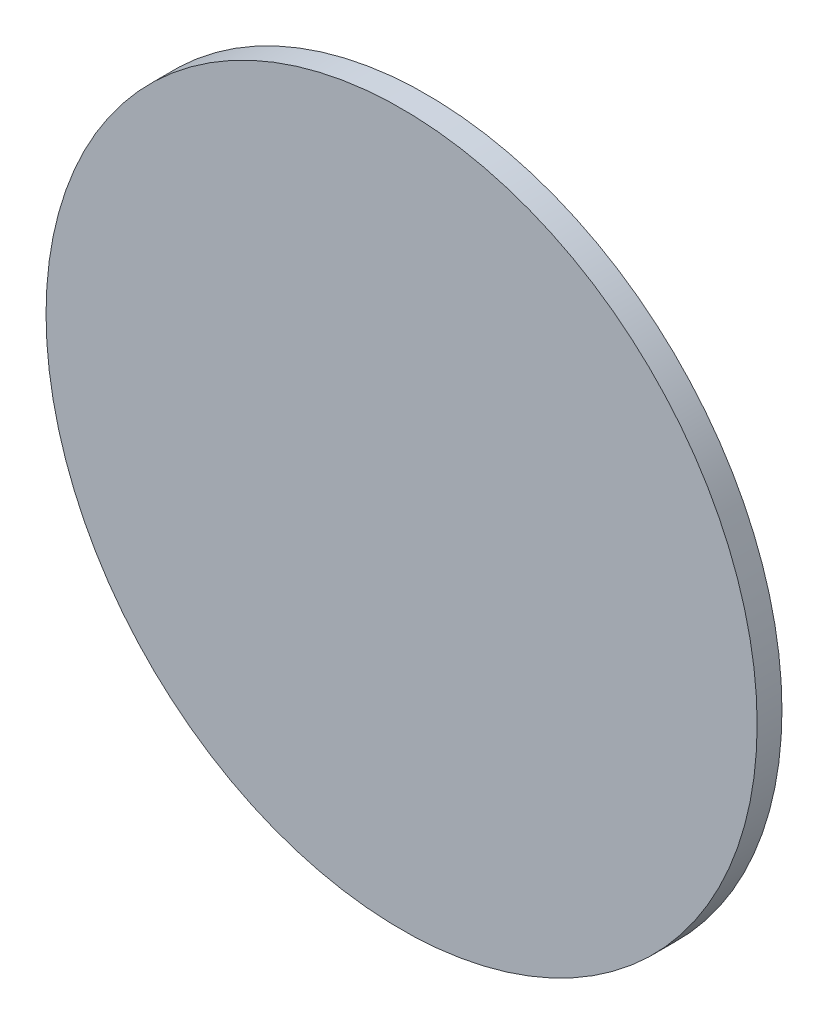
ISO-10303-21;
HEADER;
FILE_DESCRIPTION(('STEP AP214'),'2;1');
FILE_NAME('part.step','',(''),(''),'','','');
FILE_SCHEMA(('AUTOMOTIVE_DESIGN { 1 0 10303 214 1 1 1 1 }'));
ENDSEC;
DATA;
#1=APPLICATION_CONTEXT('core data for automotive mechanical design processes');
#2=APPLICATION_PROTOCOL_DEFINITION('international standard','automotive_design',2000,#1);
#3=PRODUCT_CONTEXT('',#1,'mechanical');
#4=PRODUCT('Part','Part','',(#3));
#5=PRODUCT_RELATED_PRODUCT_CATEGORY('part','',(#4));
#6=PRODUCT_DEFINITION_FORMATION('','',#4);
#7=PRODUCT_DEFINITION_CONTEXT('part definition',#1,'design');
#8=PRODUCT_DEFINITION('design','',#6,#7);
#9=PRODUCT_DEFINITION_SHAPE('','',#8);
#10=(LENGTH_UNIT() NAMED_UNIT(*) SI_UNIT(.MILLI.,.METRE.));
#11=(NAMED_UNIT(*) PLANE_ANGLE_UNIT() SI_UNIT($,.RADIAN.));
#12=(NAMED_UNIT(*) SI_UNIT($,.STERADIAN.) SOLID_ANGLE_UNIT());
#13=UNCERTAINTY_MEASURE_WITH_UNIT(LENGTH_MEASURE(1.E-05),#10,'distance_accuracy_value','');
#14=(GEOMETRIC_REPRESENTATION_CONTEXT(3) GLOBAL_UNCERTAINTY_ASSIGNED_CONTEXT((#13)) GLOBAL_UNIT_ASSIGNED_CONTEXT((#10,
#11,#12)) REPRESENTATION_CONTEXT('',''));
#15=CARTESIAN_POINT('',(0.,0.,0.));
#16=DIRECTION('',(0.,0.,1.));
#17=DIRECTION('',(1.,0.,0.));
#18=AXIS2_PLACEMENT_3D('',#15,#16,#17);
#19=CARTESIAN_POINT('',(757.5,0.,323.));
#20=DIRECTION('',(0.,0.,-1.));
#21=DIRECTION('',(-1.,0.,0.));
#22=AXIS2_PLACEMENT_3D('',#19,#20,#21);
#23=CYLINDRICAL_SURFACE('',#22,86.);
#24=CARTESIAN_POINT('',(757.5,0.,323.));
#25=DIRECTION('',(0.,0.,1.));
#26=DIRECTION('',(1.,0.,0.));
#27=AXIS2_PLACEMENT_3D('',#24,#25,#26);
#28=CIRCLE('',#27,86.);
#29=CARTESIAN_POINT('',(843.5,0.,323.));
#30=VERTEX_POINT('',#29);
#31=EDGE_CURVE('E10',#30,#30,#28,.T.);
#32=ORIENTED_EDGE('',*,*,#31,.F.);
#33=EDGE_LOOP('',(#32));
#34=FACE_BOUND('',#33,.T.);
#35=CARTESIAN_POINT('',(757.5,0.,317.));
#36=DIRECTION('',(0.,0.,1.));
#37=DIRECTION('',(1.,0.,0.));
#38=AXIS2_PLACEMENT_3D('',#35,#36,#37);
#39=CIRCLE('',#38,86.);
#40=CARTESIAN_POINT('',(843.5,0.,317.));
#41=VERTEX_POINT('',#40);
#42=EDGE_CURVE('E45',#41,#41,#39,.T.);
#43=ORIENTED_EDGE('',*,*,#42,.T.);
#44=EDGE_LOOP('',(#43));
#45=FACE_BOUND('',#44,.T.);
#46=ADVANCED_FACE('F39',(#34,#45),#23,.T.);
#47=CARTESIAN_POINT('',(757.5,0.,323.));
#48=DIRECTION('',(0.,0.,1.));
#49=DIRECTION('',(1.,0.,0.));
#50=AXIS2_PLACEMENT_3D('',#47,#48,#49);
#51=PLANE('',#50);
#52=ORIENTED_EDGE('',*,*,#31,.T.);
#53=EDGE_LOOP('',(#52));
#54=FACE_BOUND('',#53,.T.);
#55=ADVANCED_FACE('F72',(#54),#51,.T.);
#56=CARTESIAN_POINT('',(757.5,0.,317.));
#57=DIRECTION('',(0.,0.,1.));
#58=DIRECTION('',(1.,0.,0.));
#59=AXIS2_PLACEMENT_3D('',#56,#57,#58);
#60=PLANE('',#59);
#61=CARTESIAN_POINT('',(757.5,0.,317.));
#62=DIRECTION('',(0.,0.,1.));
#63=DIRECTION('',(1.,0.,0.));
#64=AXIS2_PLACEMENT_3D('',#61,#62,#63);
#65=CIRCLE('',#64,10.);
#66=CARTESIAN_POINT('',(767.5,0.,317.));
#67=VERTEX_POINT('',#66);
#68=EDGE_CURVE('E47',#67,#67,#65,.T.);
#69=ORIENTED_EDGE('',*,*,#68,.T.);
#70=EDGE_LOOP('',(#69));
#71=FACE_BOUND('',#70,.T.);
#72=ORIENTED_EDGE('',*,*,#42,.F.);
#73=EDGE_LOOP('',(#72));
#74=FACE_BOUND('',#73,.T.);
#75=ADVANCED_FACE('F60',(#71,#74),#60,.F.);
#76=CARTESIAN_POINT('',(757.5,0.,317.));
#77=DIRECTION('',(0.,0.,-1.));
#78=DIRECTION('',(-1.,0.,0.));
#79=AXIS2_PLACEMENT_3D('',#76,#77,#78);
#80=CYLINDRICAL_SURFACE('',#79,10.);
#81=ORIENTED_EDGE('',*,*,#68,.F.);
#82=EDGE_LOOP('',(#81));
#83=FACE_BOUND('',#82,.T.);
#84=CARTESIAN_POINT('',(757.5,0.,309.));
#85=DIRECTION('',(0.,0.,1.));
#86=DIRECTION('',(1.,0.,0.));
#87=AXIS2_PLACEMENT_3D('',#84,#85,#86);
#88=CIRCLE('',#87,10.);
#89=CARTESIAN_POINT('',(767.5,0.,309.));
#90=VERTEX_POINT('',#89);
#91=EDGE_CURVE('E51',#90,#90,#88,.T.);
#92=ORIENTED_EDGE('',*,*,#91,.T.);
#93=EDGE_LOOP('',(#92));
#94=FACE_BOUND('',#93,.T.);
#95=ADVANCED_FACE('F58',(#83,#94),#80,.T.);
#96=CARTESIAN_POINT('',(757.5,0.,309.));
#97=DIRECTION('',(0.,0.,1.));
#98=DIRECTION('',(1.,0.,0.));
#99=AXIS2_PLACEMENT_3D('',#96,#97,#98);
#100=PLANE('',#99);
#101=ORIENTED_EDGE('',*,*,#91,.F.);
#102=EDGE_LOOP('',(#101));
#103=FACE_BOUND('',#102,.T.);
#104=ADVANCED_FACE('F64',(#103),#100,.F.);
#105=CLOSED_SHELL('',(#46,#55,#75,#95,#104));
#106=MANIFOLD_SOLID_BREP('B2',#105);
#107=ADVANCED_BREP_SHAPE_REPRESENTATION('',(#18,#106),#14);
#108=SHAPE_DEFINITION_REPRESENTATION(#9,#107);
ENDSEC;
END-ISO-10303-21;
